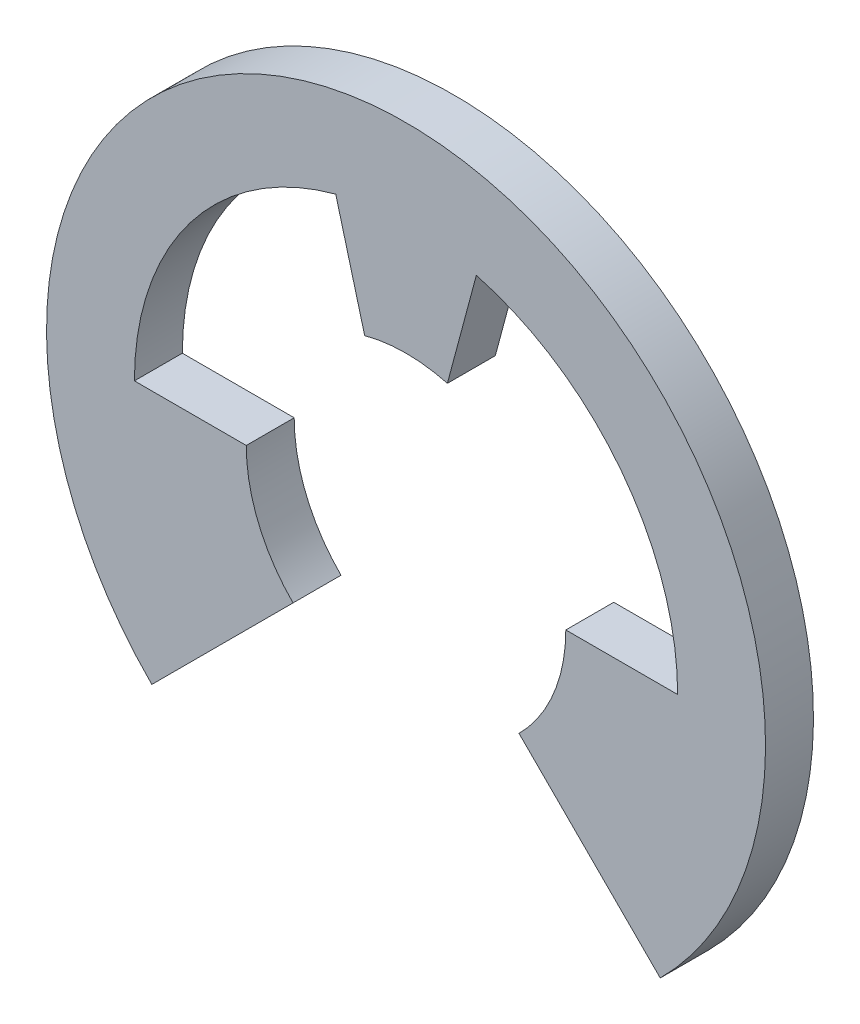
ISO-10303-21;
HEADER;
FILE_DESCRIPTION(('STEP AP214'),'2;1');
FILE_NAME('part.step','',(''),(''),'','','');
FILE_SCHEMA(('AUTOMOTIVE_DESIGN { 1 0 10303 214 1 1 1 1 }'));
ENDSEC;
DATA;
#1=APPLICATION_CONTEXT('core data for automotive mechanical design processes');
#2=APPLICATION_PROTOCOL_DEFINITION('international standard','automotive_design',2000,#1);
#3=PRODUCT_CONTEXT('',#1,'mechanical');
#4=PRODUCT('Part','Part','',(#3));
#5=PRODUCT_RELATED_PRODUCT_CATEGORY('part','',(#4));
#6=PRODUCT_DEFINITION_FORMATION('','',#4);
#7=PRODUCT_DEFINITION_CONTEXT('part definition',#1,'design');
#8=PRODUCT_DEFINITION('design','',#6,#7);
#9=PRODUCT_DEFINITION_SHAPE('','',#8);
#10=(LENGTH_UNIT() NAMED_UNIT(*) SI_UNIT(.MILLI.,.METRE.));
#11=(NAMED_UNIT(*) PLANE_ANGLE_UNIT() SI_UNIT($,.RADIAN.));
#12=(NAMED_UNIT(*) SI_UNIT($,.STERADIAN.) SOLID_ANGLE_UNIT());
#13=UNCERTAINTY_MEASURE_WITH_UNIT(LENGTH_MEASURE(1.E-05),#10,'distance_accuracy_value','');
#14=(GEOMETRIC_REPRESENTATION_CONTEXT(3) GLOBAL_UNCERTAINTY_ASSIGNED_CONTEXT((#13)) GLOBAL_UNIT_ASSIGNED_CONTEXT((#10,
#11,#12)) REPRESENTATION_CONTEXT('',''));
#15=CARTESIAN_POINT('',(0.,0.,0.));
#16=DIRECTION('',(0.,0.,1.));
#17=DIRECTION('',(1.,0.,0.));
#18=AXIS2_PLACEMENT_3D('',#15,#16,#17);
#19=CARTESIAN_POINT('',(0.,0.,0.));
#20=DIRECTION('',(0.,0.,1.));
#21=DIRECTION('',(1.,0.,0.));
#22=AXIS2_PLACEMENT_3D('',#19,#20,#21);
#23=PLANE('',#22);
#24=CARTESIAN_POINT('',(0.,0.,0.));
#25=DIRECTION('',(0.,0.,1.));
#26=DIRECTION('',(1.,0.,0.));
#27=AXIS2_PLACEMENT_3D('',#24,#25,#26);
#28=CIRCLE('',#27,2.);
#29=CARTESIAN_POINT('',(2.,0.,0.));
#30=VERTEX_POINT('',#29);
#31=CARTESIAN_POINT('',(1.41421356237309,-1.4142135623731,0.));
#32=VERTEX_POINT('',#31);
#33=EDGE_CURVE('E20',#30,#32,#28,.F.);
#34=ORIENTED_EDGE('',*,*,#33,.F.);
#35=DIRECTION('',(1.,0.,0.));
#36=VECTOR('',#35,1.);
#37=CARTESIAN_POINT('',(0.,0.,0.));
#38=LINE('',#37,#36);
#39=CARTESIAN_POINT('',(3.4,0.,0.));
#40=VERTEX_POINT('',#39);
#41=EDGE_CURVE('E101',#40,#30,#38,.F.);
#42=ORIENTED_EDGE('',*,*,#41,.F.);
#43=CARTESIAN_POINT('',(0.,0.,0.));
#44=DIRECTION('',(0.,0.,1.));
#45=DIRECTION('',(1.,0.,0.));
#46=AXIS2_PLACEMENT_3D('',#43,#44,#45);
#47=CIRCLE('',#46,3.4);
#48=CARTESIAN_POINT('',(0.879984753348571,3.28414780938283,0.));
#49=VERTEX_POINT('',#48);
#50=EDGE_CURVE('E166',#40,#49,#47,.T.);
#51=ORIENTED_EDGE('',*,*,#50,.T.);
#52=DIRECTION('',(-0.258819045102521,-0.965925826289068,0.));
#53=VECTOR('',#52,1.);
#54=CARTESIAN_POINT('',(0.517638090205041,1.93185165257814,0.));
#55=LINE('',#54,#53);
#56=CARTESIAN_POINT('',(0.517638090205039,1.93185165257813,0.));
#57=VERTEX_POINT('',#56);
#58=EDGE_CURVE('E126',#49,#57,#55,.T.);
#59=ORIENTED_EDGE('',*,*,#58,.T.);
#60=CARTESIAN_POINT('',(0.,0.,0.));
#61=DIRECTION('',(0.,0.,1.));
#62=DIRECTION('',(1.,0.,0.));
#63=AXIS2_PLACEMENT_3D('',#60,#61,#62);
#64=CIRCLE('',#63,2.);
#65=CARTESIAN_POINT('',(-0.517638090205037,1.93185165257812,0.));
#66=VERTEX_POINT('',#65);
#67=EDGE_CURVE('E168',#57,#66,#64,.T.);
#68=ORIENTED_EDGE('',*,*,#67,.T.);
#69=DIRECTION('',(-0.258819045102521,0.965925826289068,0.));
#70=VECTOR('',#69,1.);
#71=CARTESIAN_POINT('',(-0.879984753348571,3.28414780938283,0.));
#72=LINE('',#71,#70);
#73=CARTESIAN_POINT('',(-0.879984753348571,3.28414780938283,0.));
#74=VERTEX_POINT('',#73);
#75=EDGE_CURVE('E131',#66,#74,#72,.T.);
#76=ORIENTED_EDGE('',*,*,#75,.T.);
#77=CARTESIAN_POINT('',(0.,0.,0.));
#78=DIRECTION('',(0.,0.,1.));
#79=DIRECTION('',(1.,0.,0.));
#80=AXIS2_PLACEMENT_3D('',#77,#78,#79);
#81=CIRCLE('',#80,3.4);
#82=CARTESIAN_POINT('',(-3.4,0.,0.));
#83=VERTEX_POINT('',#82);
#84=EDGE_CURVE('E171',#74,#83,#81,.T.);
#85=ORIENTED_EDGE('',*,*,#84,.T.);
#86=DIRECTION('',(1.,0.,0.));
#87=VECTOR('',#86,1.);
#88=CARTESIAN_POINT('',(-2.,0.,0.));
#89=LINE('',#88,#87);
#90=CARTESIAN_POINT('',(-2.,0.,0.));
#91=VERTEX_POINT('',#90);
#92=EDGE_CURVE('E136',#83,#91,#89,.T.);
#93=ORIENTED_EDGE('',*,*,#92,.T.);
#94=CARTESIAN_POINT('',(0.,0.,0.));
#95=DIRECTION('',(0.,0.,1.));
#96=DIRECTION('',(1.,0.,0.));
#97=AXIS2_PLACEMENT_3D('',#94,#95,#96);
#98=CIRCLE('',#97,2.);
#99=CARTESIAN_POINT('',(-1.4142135623731,-1.4142135623731,0.));
#100=VERTEX_POINT('',#99);
#101=EDGE_CURVE('E174',#91,#100,#98,.T.);
#102=ORIENTED_EDGE('',*,*,#101,.T.);
#103=DIRECTION('',(-0.707106781186548,-0.707106781186548,0.));
#104=VECTOR('',#103,1.);
#105=CARTESIAN_POINT('',(-3.18198051533946,-3.18198051533946,0.));
#106=LINE('',#105,#104);
#107=CARTESIAN_POINT('',(-3.18198051533946,-3.18198051533946,0.));
#108=VERTEX_POINT('',#107);
#109=EDGE_CURVE('E141',#100,#108,#106,.T.);
#110=ORIENTED_EDGE('',*,*,#109,.T.);
#111=CARTESIAN_POINT('',(0.,0.,0.));
#112=DIRECTION('',(0.,0.,1.));
#113=DIRECTION('',(1.,0.,0.));
#114=AXIS2_PLACEMENT_3D('',#111,#112,#113);
#115=CIRCLE('',#114,4.5);
#116=CARTESIAN_POINT('',(3.18198051533946,-3.18198051533946,0.));
#117=VERTEX_POINT('',#116);
#118=EDGE_CURVE('E120',#117,#108,#115,.T.);
#119=ORIENTED_EDGE('',*,*,#118,.F.);
#120=DIRECTION('',(-0.707106781186548,0.707106781186548,0.));
#121=VECTOR('',#120,1.);
#122=CARTESIAN_POINT('',(1.41421356237309,-1.41421356237309,0.));
#123=LINE('',#122,#121);
#124=EDGE_CURVE('E118',#117,#32,#123,.T.);
#125=ORIENTED_EDGE('',*,*,#124,.T.);
#126=EDGE_LOOP('',(#34,#42,#51,#59,#68,#76,#85,#93,#102,#110,#119,#125));
#127=FACE_BOUND('',#126,.T.);
#128=ADVANCED_FACE('F17',(#127),#23,.F.);
#129=CARTESIAN_POINT('',(1.41421356237309,-1.41421356237309,0.6));
#130=DIRECTION('',(0.707106781186548,0.707106781186548,0.));
#131=DIRECTION('',(-0.707106781186548,0.707106781186548,0.));
#132=AXIS2_PLACEMENT_3D('',#129,#130,#131);
#133=PLANE('',#132);
#134=DIRECTION('',(0.,0.,1.));
#135=VECTOR('',#134,1.);
#136=CARTESIAN_POINT('',(3.18198051533946,-3.18198051533946,0.6));
#137=LINE('',#136,#135);
#138=CARTESIAN_POINT('',(3.18198051533946,-3.18198051533946,0.6));
#139=VERTEX_POINT('',#138);
#140=EDGE_CURVE('E122',#139,#117,#137,.F.);
#141=ORIENTED_EDGE('',*,*,#140,.F.);
#142=DIRECTION('',(0.70710678118655,-0.707106781186546,0.));
#143=VECTOR('',#142,1.);
#144=CARTESIAN_POINT('',(1.41421356237309,-1.4142135623731,0.6));
#145=LINE('',#144,#143);
#146=CARTESIAN_POINT('',(1.41421356237309,-1.4142135623731,0.6));
#147=VERTEX_POINT('',#146);
#148=EDGE_CURVE('E165',#147,#139,#145,.T.);
#149=ORIENTED_EDGE('',*,*,#148,.F.);
#150=DIRECTION('',(0.,0.,1.));
#151=VECTOR('',#150,1.);
#152=CARTESIAN_POINT('',(1.41421356237309,-1.4142135623731,0.6));
#153=LINE('',#152,#151);
#154=EDGE_CURVE('E115',#147,#32,#153,.F.);
#155=ORIENTED_EDGE('',*,*,#154,.T.);
#156=ORIENTED_EDGE('',*,*,#124,.F.);
#157=EDGE_LOOP('',(#141,#149,#155,#156));
#158=FACE_BOUND('',#157,.T.);
#159=ADVANCED_FACE('F190',(#158),#133,.F.);
#160=CARTESIAN_POINT('',(0.,0.,0.6));
#161=DIRECTION('',(0.,0.,1.));
#162=DIRECTION('',(1.,0.,0.));
#163=AXIS2_PLACEMENT_3D('',#160,#161,#162);
#164=CYLINDRICAL_SURFACE('',#163,4.5);
#165=CARTESIAN_POINT('',(0.,0.,0.6));
#166=DIRECTION('',(0.,0.,1.));
#167=DIRECTION('',(1.,0.,0.));
#168=AXIS2_PLACEMENT_3D('',#165,#166,#167);
#169=CIRCLE('',#168,4.5);
#170=CARTESIAN_POINT('',(-3.18198051533946,-3.18198051533947,0.6));
#171=VERTEX_POINT('',#170);
#172=EDGE_CURVE('E162',#139,#171,#169,.T.);
#173=ORIENTED_EDGE('',*,*,#172,.F.);
#174=ORIENTED_EDGE('',*,*,#140,.T.);
#175=ORIENTED_EDGE('',*,*,#118,.T.);
#176=DIRECTION('',(0.,0.,1.));
#177=VECTOR('',#176,1.);
#178=CARTESIAN_POINT('',(-3.18198051533946,-3.18198051533946,0.6));
#179=LINE('',#178,#177);
#180=EDGE_CURVE('E144',#108,#171,#179,.T.);
#181=ORIENTED_EDGE('',*,*,#180,.T.);
#182=EDGE_LOOP('',(#173,#174,#175,#181));
#183=FACE_BOUND('',#182,.T.);
#184=ADVANCED_FACE('F187',(#183),#164,.T.);
#185=CARTESIAN_POINT('',(-3.18198051533946,-3.18198051533946,0.6));
#186=DIRECTION('',(-0.707106781186548,0.707106781186548,0.));
#187=DIRECTION('',(-0.707106781186548,-0.707106781186548,0.));
#188=AXIS2_PLACEMENT_3D('',#185,#186,#187);
#189=PLANE('',#188);
#190=DIRECTION('',(0.,0.,1.));
#191=VECTOR('',#190,1.);
#192=CARTESIAN_POINT('',(-1.4142135623731,-1.4142135623731,0.6));
#193=LINE('',#192,#191);
#194=CARTESIAN_POINT('',(-1.4142135623731,-1.4142135623731,0.6));
#195=VERTEX_POINT('',#194);
#196=EDGE_CURVE('E143',#100,#195,#193,.T.);
#197=ORIENTED_EDGE('',*,*,#196,.T.);
#198=DIRECTION('',(0.707106781186546,0.70710678118655,0.));
#199=VECTOR('',#198,1.);
#200=CARTESIAN_POINT('',(-3.18198051533946,-3.18198051533947,0.6));
#201=LINE('',#200,#199);
#202=EDGE_CURVE('E161',#171,#195,#201,.T.);
#203=ORIENTED_EDGE('',*,*,#202,.F.);
#204=ORIENTED_EDGE('',*,*,#180,.F.);
#205=ORIENTED_EDGE('',*,*,#109,.F.);
#206=EDGE_LOOP('',(#197,#203,#204,#205));
#207=FACE_BOUND('',#206,.T.);
#208=ADVANCED_FACE('F217',(#207),#189,.F.);
#209=CARTESIAN_POINT('',(0.,0.,0.6));
#210=DIRECTION('',(0.,0.,1.));
#211=DIRECTION('',(1.,0.,0.));
#212=AXIS2_PLACEMENT_3D('',#209,#210,#211);
#213=CYLINDRICAL_SURFACE('',#212,2.);
#214=DIRECTION('',(0.,0.,-1.));
#215=VECTOR('',#214,1.);
#216=CARTESIAN_POINT('',(-2.,0.,0.6));
#217=LINE('',#216,#215);
#218=CARTESIAN_POINT('',(-2.,0.,0.6));
#219=VERTEX_POINT('',#218);
#220=EDGE_CURVE('E140',#91,#219,#217,.F.);
#221=ORIENTED_EDGE('',*,*,#220,.T.);
#222=CARTESIAN_POINT('',(0.,0.,0.6));
#223=DIRECTION('',(0.,0.,1.));
#224=DIRECTION('',(1.,0.,0.));
#225=AXIS2_PLACEMENT_3D('',#222,#223,#224);
#226=CIRCLE('',#225,2.);
#227=EDGE_CURVE('E158',#195,#219,#226,.F.);
#228=ORIENTED_EDGE('',*,*,#227,.F.);
#229=ORIENTED_EDGE('',*,*,#196,.F.);
#230=ORIENTED_EDGE('',*,*,#101,.F.);
#231=EDGE_LOOP('',(#221,#228,#229,#230));
#232=FACE_BOUND('',#231,.T.);
#233=ADVANCED_FACE('F219',(#232),#213,.F.);
#234=CARTESIAN_POINT('',(-2.,0.,0.6));
#235=DIRECTION('',(0.,-1.,0.));
#236=DIRECTION('',(0.,0.,-1.));
#237=AXIS2_PLACEMENT_3D('',#234,#235,#236);
#238=PLANE('',#237);
#239=DIRECTION('',(0.,0.,1.));
#240=VECTOR('',#239,1.);
#241=CARTESIAN_POINT('',(-3.4,0.,0.6));
#242=LINE('',#241,#240);
#243=CARTESIAN_POINT('',(-3.4,0.,0.6));
#244=VERTEX_POINT('',#243);
#245=EDGE_CURVE('E139',#83,#244,#242,.T.);
#246=ORIENTED_EDGE('',*,*,#245,.T.);
#247=DIRECTION('',(1.,0.,0.));
#248=VECTOR('',#247,1.);
#249=CARTESIAN_POINT('',(0.,0.,0.6));
#250=LINE('',#249,#248);
#251=EDGE_CURVE('E157',#219,#244,#250,.F.);
#252=ORIENTED_EDGE('',*,*,#251,.F.);
#253=ORIENTED_EDGE('',*,*,#220,.F.);
#254=ORIENTED_EDGE('',*,*,#92,.F.);
#255=EDGE_LOOP('',(#246,#252,#253,#254));
#256=FACE_BOUND('',#255,.T.);
#257=ADVANCED_FACE('F202',(#256),#238,.F.);
#258=CARTESIAN_POINT('',(0.,0.,0.6));
#259=DIRECTION('',(0.,0.,1.));
#260=DIRECTION('',(1.,0.,0.));
#261=AXIS2_PLACEMENT_3D('',#258,#259,#260);
#262=CYLINDRICAL_SURFACE('',#261,3.4);
#263=DIRECTION('',(0.,0.,1.));
#264=VECTOR('',#263,1.);
#265=CARTESIAN_POINT('',(-0.879984753348571,3.28414780938283,0.6));
#266=LINE('',#265,#264);
#267=CARTESIAN_POINT('',(-0.879984753348571,3.28414780938283,0.6));
#268=VERTEX_POINT('',#267);
#269=EDGE_CURVE('E135',#74,#268,#266,.T.);
#270=ORIENTED_EDGE('',*,*,#269,.T.);
#271=CARTESIAN_POINT('',(0.,0.,0.6));
#272=DIRECTION('',(0.,0.,1.));
#273=DIRECTION('',(1.,0.,0.));
#274=AXIS2_PLACEMENT_3D('',#271,#272,#273);
#275=CIRCLE('',#274,3.4);
#276=EDGE_CURVE('E154',#244,#268,#275,.F.);
#277=ORIENTED_EDGE('',*,*,#276,.F.);
#278=ORIENTED_EDGE('',*,*,#245,.F.);
#279=ORIENTED_EDGE('',*,*,#84,.F.);
#280=EDGE_LOOP('',(#270,#277,#278,#279));
#281=FACE_BOUND('',#280,.T.);
#282=ADVANCED_FACE('F206',(#281),#262,.F.);
#283=CARTESIAN_POINT('',(-0.879984753348571,3.28414780938283,0.6));
#284=DIRECTION('',(0.965925826289068,0.258819045102521,0.));
#285=DIRECTION('',(-0.258819045102521,0.965925826289068,0.));
#286=AXIS2_PLACEMENT_3D('',#283,#284,#285);
#287=PLANE('',#286);
#288=DIRECTION('',(0.,0.,1.));
#289=VECTOR('',#288,1.);
#290=CARTESIAN_POINT('',(-0.517638090205036,1.93185165257812,0.6));
#291=LINE('',#290,#289);
#292=CARTESIAN_POINT('',(-0.517638090205036,1.93185165257812,0.6));
#293=VERTEX_POINT('',#292);
#294=EDGE_CURVE('E134',#66,#293,#291,.T.);
#295=ORIENTED_EDGE('',*,*,#294,.T.);
#296=DIRECTION('',(0.258819045102522,-0.965925826289068,0.));
#297=VECTOR('',#296,1.);
#298=CARTESIAN_POINT('',(-0.87998475334857,3.28414780938283,0.6));
#299=LINE('',#298,#297);
#300=EDGE_CURVE('E153',#268,#293,#299,.T.);
#301=ORIENTED_EDGE('',*,*,#300,.F.);
#302=ORIENTED_EDGE('',*,*,#269,.F.);
#303=ORIENTED_EDGE('',*,*,#75,.F.);
#304=EDGE_LOOP('',(#295,#301,#302,#303));
#305=FACE_BOUND('',#304,.T.);
#306=ADVANCED_FACE('F249',(#305),#287,.F.);
#307=CARTESIAN_POINT('',(0.,0.,0.6));
#308=DIRECTION('',(0.,0.,1.));
#309=DIRECTION('',(1.,0.,0.));
#310=AXIS2_PLACEMENT_3D('',#307,#308,#309);
#311=CYLINDRICAL_SURFACE('',#310,2.);
#312=DIRECTION('',(0.,0.,1.));
#313=VECTOR('',#312,1.);
#314=CARTESIAN_POINT('',(0.517638090205041,1.93185165257814,0.6));
#315=LINE('',#314,#313);
#316=CARTESIAN_POINT('',(0.517638090205039,1.93185165257813,0.6));
#317=VERTEX_POINT('',#316);
#318=EDGE_CURVE('E130',#57,#317,#315,.T.);
#319=ORIENTED_EDGE('',*,*,#318,.T.);
#320=CARTESIAN_POINT('',(0.,0.,0.6));
#321=DIRECTION('',(0.,0.,1.));
#322=DIRECTION('',(1.,0.,0.));
#323=AXIS2_PLACEMENT_3D('',#320,#321,#322);
#324=CIRCLE('',#323,2.);
#325=EDGE_CURVE('E150',#293,#317,#324,.F.);
#326=ORIENTED_EDGE('',*,*,#325,.F.);
#327=ORIENTED_EDGE('',*,*,#294,.F.);
#328=ORIENTED_EDGE('',*,*,#67,.F.);
#329=EDGE_LOOP('',(#319,#326,#327,#328));
#330=FACE_BOUND('',#329,.T.);
#331=ADVANCED_FACE('F245',(#330),#311,.F.);
#332=CARTESIAN_POINT('',(0.517638090205041,1.93185165257814,0.6));
#333=DIRECTION('',(-0.965925826289068,0.258819045102521,0.));
#334=DIRECTION('',(-0.258819045102521,-0.965925826289068,0.));
#335=AXIS2_PLACEMENT_3D('',#332,#333,#334);
#336=PLANE('',#335);
#337=DIRECTION('',(0.,0.,1.));
#338=VECTOR('',#337,1.);
#339=CARTESIAN_POINT('',(0.879984753348572,3.28414780938283,0.6));
#340=LINE('',#339,#338);
#341=CARTESIAN_POINT('',(0.879984753348572,3.28414780938283,0.6));
#342=VERTEX_POINT('',#341);
#343=EDGE_CURVE('E129',#49,#342,#340,.T.);
#344=ORIENTED_EDGE('',*,*,#343,.T.);
#345=DIRECTION('',(0.258819045102522,0.965925826289068,0.));
#346=VECTOR('',#345,1.);
#347=CARTESIAN_POINT('',(0.517638090205041,1.93185165257814,0.6));
#348=LINE('',#347,#346);
#349=EDGE_CURVE('E149',#317,#342,#348,.T.);
#350=ORIENTED_EDGE('',*,*,#349,.F.);
#351=ORIENTED_EDGE('',*,*,#318,.F.);
#352=ORIENTED_EDGE('',*,*,#58,.F.);
#353=EDGE_LOOP('',(#344,#350,#351,#352));
#354=FACE_BOUND('',#353,.T.);
#355=ADVANCED_FACE('F241',(#354),#336,.F.);
#356=CARTESIAN_POINT('',(0.,0.,0.6));
#357=DIRECTION('',(0.,0.,1.));
#358=DIRECTION('',(1.,0.,0.));
#359=AXIS2_PLACEMENT_3D('',#356,#357,#358);
#360=CYLINDRICAL_SURFACE('',#359,3.4);
#361=DIRECTION('',(0.,0.,-1.));
#362=VECTOR('',#361,1.);
#363=CARTESIAN_POINT('',(3.4,0.,0.6));
#364=LINE('',#363,#362);
#365=CARTESIAN_POINT('',(3.4,0.,0.6));
#366=VERTEX_POINT('',#365);
#367=EDGE_CURVE('E103',#40,#366,#364,.F.);
#368=ORIENTED_EDGE('',*,*,#367,.T.);
#369=CARTESIAN_POINT('',(0.,0.,0.6));
#370=DIRECTION('',(0.,0.,1.));
#371=DIRECTION('',(1.,0.,0.));
#372=AXIS2_PLACEMENT_3D('',#369,#370,#371);
#373=CIRCLE('',#372,3.4);
#374=EDGE_CURVE('E146',#342,#366,#373,.F.);
#375=ORIENTED_EDGE('',*,*,#374,.F.);
#376=ORIENTED_EDGE('',*,*,#343,.F.);
#377=ORIENTED_EDGE('',*,*,#50,.F.);
#378=EDGE_LOOP('',(#368,#375,#376,#377));
#379=FACE_BOUND('',#378,.T.);
#380=ADVANCED_FACE('F238',(#379),#360,.F.);
#381=CARTESIAN_POINT('',(3.4,0.,0.6));
#382=DIRECTION('',(0.,-1.,0.));
#383=DIRECTION('',(0.,0.,-1.));
#384=AXIS2_PLACEMENT_3D('',#381,#382,#383);
#385=PLANE('',#384);
#386=DIRECTION('',(0.,0.,1.));
#387=VECTOR('',#386,1.);
#388=CARTESIAN_POINT('',(2.,0.,0.6));
#389=LINE('',#388,#387);
#390=CARTESIAN_POINT('',(2.,0.,0.6));
#391=VERTEX_POINT('',#390);
#392=EDGE_CURVE('E35',#30,#391,#389,.T.);
#393=ORIENTED_EDGE('',*,*,#392,.T.);
#394=DIRECTION('',(1.,0.,0.));
#395=VECTOR('',#394,1.);
#396=CARTESIAN_POINT('',(0.,0.,0.6));
#397=LINE('',#396,#395);
#398=EDGE_CURVE('E26',#366,#391,#397,.F.);
#399=ORIENTED_EDGE('',*,*,#398,.F.);
#400=ORIENTED_EDGE('',*,*,#367,.F.);
#401=ORIENTED_EDGE('',*,*,#41,.T.);
#402=EDGE_LOOP('',(#393,#399,#400,#401));
#403=FACE_BOUND('',#402,.T.);
#404=ADVANCED_FACE('F102',(#403),#385,.F.);
#405=CARTESIAN_POINT('',(0.,0.,0.6));
#406=DIRECTION('',(0.,0.,1.));
#407=DIRECTION('',(1.,0.,0.));
#408=AXIS2_PLACEMENT_3D('',#405,#406,#407);
#409=CYLINDRICAL_SURFACE('',#408,2.);
#410=ORIENTED_EDGE('',*,*,#154,.F.);
#411=CARTESIAN_POINT('',(0.,0.,0.6));
#412=DIRECTION('',(0.,0.,1.));
#413=DIRECTION('',(1.,0.,0.));
#414=AXIS2_PLACEMENT_3D('',#411,#412,#413);
#415=CIRCLE('',#414,2.);
#416=EDGE_CURVE('E11',#391,#147,#415,.F.);
#417=ORIENTED_EDGE('',*,*,#416,.F.);
#418=ORIENTED_EDGE('',*,*,#392,.F.);
#419=ORIENTED_EDGE('',*,*,#33,.T.);
#420=EDGE_LOOP('',(#410,#417,#418,#419));
#421=FACE_BOUND('',#420,.T.);
#422=ADVANCED_FACE('F112',(#421),#409,.F.);
#423=CARTESIAN_POINT('',(0.,0.,0.6));
#424=DIRECTION('',(0.,0.,1.));
#425=DIRECTION('',(1.,0.,0.));
#426=AXIS2_PLACEMENT_3D('',#423,#424,#425);
#427=PLANE('',#426);
#428=ORIENTED_EDGE('',*,*,#398,.T.);
#429=ORIENTED_EDGE('',*,*,#416,.T.);
#430=ORIENTED_EDGE('',*,*,#148,.T.);
#431=ORIENTED_EDGE('',*,*,#172,.T.);
#432=ORIENTED_EDGE('',*,*,#202,.T.);
#433=ORIENTED_EDGE('',*,*,#227,.T.);
#434=ORIENTED_EDGE('',*,*,#251,.T.);
#435=ORIENTED_EDGE('',*,*,#276,.T.);
#436=ORIENTED_EDGE('',*,*,#300,.T.);
#437=ORIENTED_EDGE('',*,*,#325,.T.);
#438=ORIENTED_EDGE('',*,*,#349,.T.);
#439=ORIENTED_EDGE('',*,*,#374,.T.);
#440=EDGE_LOOP('',(#428,#429,#430,#431,#432,#433,#434,#435,#436,#437,#438,#439));
#441=FACE_BOUND('',#440,.T.);
#442=ADVANCED_FACE('F211',(#441),#427,.T.);
#443=CLOSED_SHELL('',(#128,#159,#184,#208,#233,#257,#282,#306,#331,#355,#380,#404,#422,#442));
#444=MANIFOLD_SOLID_BREP('B1',#443);
#445=ADVANCED_BREP_SHAPE_REPRESENTATION('',(#18,#444),#14);
#446=SHAPE_DEFINITION_REPRESENTATION(#9,#445);
ENDSEC;
END-ISO-10303-21;
